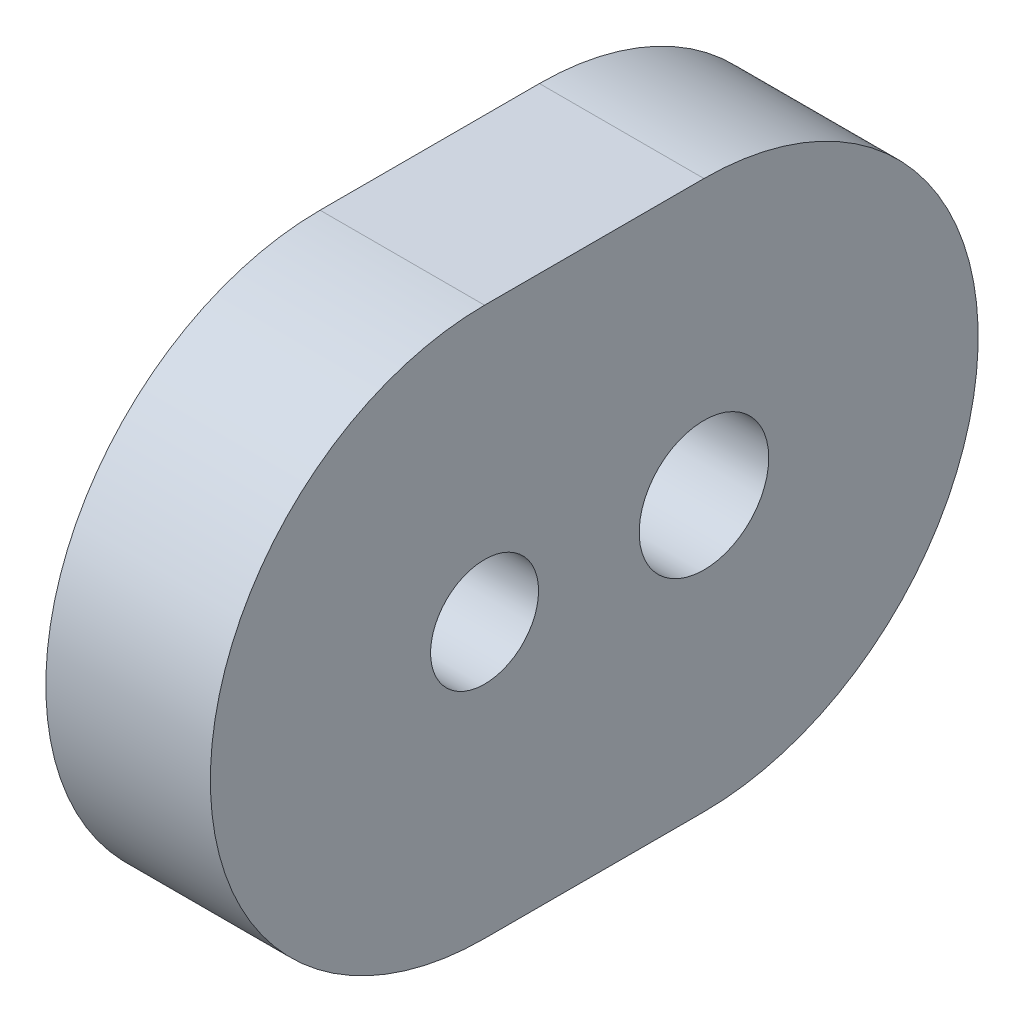
ISO-10303-21;
HEADER;
FILE_DESCRIPTION(('STEP AP214'),'2;1');
FILE_NAME('part.step','',(''),(''),'','','');
FILE_SCHEMA(('AUTOMOTIVE_DESIGN { 1 0 10303 214 1 1 1 1 }'));
ENDSEC;
DATA;
#1=APPLICATION_CONTEXT('core data for automotive mechanical design processes');
#2=APPLICATION_PROTOCOL_DEFINITION('international standard','automotive_design',2000,#1);
#3=PRODUCT_CONTEXT('',#1,'mechanical');
#4=PRODUCT('Part','Part','',(#3));
#5=PRODUCT_RELATED_PRODUCT_CATEGORY('part','',(#4));
#6=PRODUCT_DEFINITION_FORMATION('','',#4);
#7=PRODUCT_DEFINITION_CONTEXT('part definition',#1,'design');
#8=PRODUCT_DEFINITION('design','',#6,#7);
#9=PRODUCT_DEFINITION_SHAPE('','',#8);
#10=(LENGTH_UNIT() NAMED_UNIT(*) SI_UNIT(.MILLI.,.METRE.));
#11=(NAMED_UNIT(*) PLANE_ANGLE_UNIT() SI_UNIT($,.RADIAN.));
#12=(NAMED_UNIT(*) SI_UNIT($,.STERADIAN.) SOLID_ANGLE_UNIT());
#13=UNCERTAINTY_MEASURE_WITH_UNIT(LENGTH_MEASURE(1.E-05),#10,'distance_accuracy_value','');
#14=(GEOMETRIC_REPRESENTATION_CONTEXT(3) GLOBAL_UNCERTAINTY_ASSIGNED_CONTEXT((#13)) GLOBAL_UNIT_ASSIGNED_CONTEXT((#10,
#11,#12)) REPRESENTATION_CONTEXT('',''));
#15=CARTESIAN_POINT('',(0.,0.,0.));
#16=DIRECTION('',(0.,0.,1.));
#17=DIRECTION('',(1.,0.,0.));
#18=AXIS2_PLACEMENT_3D('',#15,#16,#17);
#19=CARTESIAN_POINT('',(3.81,6.35,0.));
#20=DIRECTION('',(-1.,0.,0.));
#21=DIRECTION('',(0.,0.,1.));
#22=AXIS2_PLACEMENT_3D('',#19,#20,#21);
#23=CYLINDRICAL_SURFACE('',#22,6.35);
#24=CARTESIAN_POINT('',(0.,6.35,0.));
#25=DIRECTION('',(1.,0.,0.));
#26=DIRECTION('',(0.,0.,-1.));
#27=AXIS2_PLACEMENT_3D('',#24,#25,#26);
#28=CIRCLE('',#27,6.35);
#29=CARTESIAN_POINT('',(0.,12.7,0.));
#30=VERTEX_POINT('',#29);
#31=CARTESIAN_POINT('',(0.,0.,0.));
#32=VERTEX_POINT('',#31);
#33=EDGE_CURVE('E95',#30,#32,#28,.T.);
#34=ORIENTED_EDGE('',*,*,#33,.T.);
#35=DIRECTION('',(-1.,0.,0.));
#36=VECTOR('',#35,1.);
#37=CARTESIAN_POINT('',(3.81,0.,0.));
#38=LINE('',#37,#36);
#39=CARTESIAN_POINT('',(3.81,0.,0.));
#40=VERTEX_POINT('',#39);
#41=EDGE_CURVE('E11',#40,#32,#38,.T.);
#42=ORIENTED_EDGE('',*,*,#41,.F.);
#43=CARTESIAN_POINT('',(3.81,6.35,0.));
#44=DIRECTION('',(1.,0.,0.));
#45=DIRECTION('',(0.,0.,-1.));
#46=AXIS2_PLACEMENT_3D('',#43,#44,#45);
#47=CIRCLE('',#46,6.35);
#48=CARTESIAN_POINT('',(3.81,12.7,0.));
#49=VERTEX_POINT('',#48);
#50=EDGE_CURVE('E83',#49,#40,#47,.T.);
#51=ORIENTED_EDGE('',*,*,#50,.F.);
#52=DIRECTION('',(-1.,0.,0.));
#53=VECTOR('',#52,1.);
#54=CARTESIAN_POINT('',(3.81,12.7,0.));
#55=LINE('',#54,#53);
#56=EDGE_CURVE('E91',#49,#30,#55,.T.);
#57=ORIENTED_EDGE('',*,*,#56,.T.);
#58=EDGE_LOOP('',(#34,#42,#51,#57));
#59=FACE_BOUND('',#58,.T.);
#60=ADVANCED_FACE('F32',(#59),#23,.T.);
#61=CARTESIAN_POINT('',(3.81,0.,0.));
#62=DIRECTION('',(0.,1.,0.));
#63=DIRECTION('',(0.,0.,1.));
#64=AXIS2_PLACEMENT_3D('',#61,#62,#63);
#65=PLANE('',#64);
#66=DIRECTION('',(0.,0.,-1.));
#67=VECTOR('',#66,1.);
#68=CARTESIAN_POINT('',(0.,0.,0.));
#69=LINE('',#68,#67);
#70=CARTESIAN_POINT('',(0.,0.,-5.08));
#71=VERTEX_POINT('',#70);
#72=EDGE_CURVE('E87',#32,#71,#69,.T.);
#73=ORIENTED_EDGE('',*,*,#72,.T.);
#74=DIRECTION('',(-1.,0.,0.));
#75=VECTOR('',#74,1.);
#76=CARTESIAN_POINT('',(3.81,0.,-5.08));
#77=LINE('',#76,#75);
#78=CARTESIAN_POINT('',(3.81,0.,-5.08));
#79=VERTEX_POINT('',#78);
#80=EDGE_CURVE('E40',#79,#71,#77,.T.);
#81=ORIENTED_EDGE('',*,*,#80,.F.);
#82=DIRECTION('',(0.,0.,-1.));
#83=VECTOR('',#82,1.);
#84=CARTESIAN_POINT('',(3.81,0.,0.));
#85=LINE('',#84,#83);
#86=EDGE_CURVE('E78',#40,#79,#85,.T.);
#87=ORIENTED_EDGE('',*,*,#86,.F.);
#88=ORIENTED_EDGE('',*,*,#41,.T.);
#89=EDGE_LOOP('',(#73,#81,#87,#88));
#90=FACE_BOUND('',#89,.T.);
#91=ADVANCED_FACE('F86',(#90),#65,.F.);
#92=CARTESIAN_POINT('',(3.81,6.35,-5.08));
#93=DIRECTION('',(-1.,0.,0.));
#94=DIRECTION('',(0.,0.,1.));
#95=AXIS2_PLACEMENT_3D('',#92,#93,#94);
#96=CYLINDRICAL_SURFACE('',#95,6.35);
#97=CARTESIAN_POINT('',(0.,6.35,-5.08));
#98=DIRECTION('',(1.,0.,0.));
#99=DIRECTION('',(0.,0.,1.));
#100=AXIS2_PLACEMENT_3D('',#97,#98,#99);
#101=CIRCLE('',#100,6.35);
#102=CARTESIAN_POINT('',(0.,12.7,-5.08));
#103=VERTEX_POINT('',#102);
#104=EDGE_CURVE('E65',#71,#103,#101,.T.);
#105=ORIENTED_EDGE('',*,*,#104,.T.);
#106=DIRECTION('',(-1.,0.,0.));
#107=VECTOR('',#106,1.);
#108=CARTESIAN_POINT('',(3.81,12.7,-5.08));
#109=LINE('',#108,#107);
#110=CARTESIAN_POINT('',(3.81,12.7,-5.08));
#111=VERTEX_POINT('',#110);
#112=EDGE_CURVE('E88',#111,#103,#109,.T.);
#113=ORIENTED_EDGE('',*,*,#112,.F.);
#114=CARTESIAN_POINT('',(3.81,6.35,-5.08));
#115=DIRECTION('',(1.,0.,0.));
#116=DIRECTION('',(0.,0.,1.));
#117=AXIS2_PLACEMENT_3D('',#114,#115,#116);
#118=CIRCLE('',#117,6.35);
#119=EDGE_CURVE('E81',#79,#111,#118,.T.);
#120=ORIENTED_EDGE('',*,*,#119,.F.);
#121=ORIENTED_EDGE('',*,*,#80,.T.);
#122=EDGE_LOOP('',(#105,#113,#120,#121));
#123=FACE_BOUND('',#122,.T.);
#124=ADVANCED_FACE('F89',(#123),#96,.T.);
#125=CARTESIAN_POINT('',(3.81,12.7,0.));
#126=DIRECTION('',(0.,-1.,0.));
#127=DIRECTION('',(0.,0.,-1.));
#128=AXIS2_PLACEMENT_3D('',#125,#126,#127);
#129=PLANE('',#128);
#130=DIRECTION('',(0.,0.,1.));
#131=VECTOR('',#130,1.);
#132=CARTESIAN_POINT('',(0.,12.7,0.));
#133=LINE('',#132,#131);
#134=EDGE_CURVE('E71',#103,#30,#133,.T.);
#135=ORIENTED_EDGE('',*,*,#134,.T.);
#136=ORIENTED_EDGE('',*,*,#56,.F.);
#137=DIRECTION('',(0.,0.,1.));
#138=VECTOR('',#137,1.);
#139=CARTESIAN_POINT('',(3.81,12.7,0.));
#140=LINE('',#139,#138);
#141=EDGE_CURVE('E48',#111,#49,#140,.T.);
#142=ORIENTED_EDGE('',*,*,#141,.F.);
#143=ORIENTED_EDGE('',*,*,#112,.T.);
#144=EDGE_LOOP('',(#135,#136,#142,#143));
#145=FACE_BOUND('',#144,.T.);
#146=ADVANCED_FACE('F103',(#145),#129,.F.);
#147=CARTESIAN_POINT('',(3.81,6.35,0.));
#148=DIRECTION('',(1.,0.,0.));
#149=DIRECTION('',(0.,0.,-1.));
#150=AXIS2_PLACEMENT_3D('',#147,#148,#149);
#151=PLANE('',#150);
#152=CARTESIAN_POINT('',(3.81,6.35,-5.08));
#153=DIRECTION('',(1.,0.,0.));
#154=DIRECTION('',(0.,0.,-1.));
#155=AXIS2_PLACEMENT_3D('',#152,#153,#154);
#156=CIRCLE('',#155,1.5);
#157=CARTESIAN_POINT('',(3.81,6.35,-6.58));
#158=VERTEX_POINT('',#157);
#159=EDGE_CURVE('E117',#158,#158,#156,.T.);
#160=ORIENTED_EDGE('',*,*,#159,.F.);
#161=EDGE_LOOP('',(#160));
#162=FACE_BOUND('',#161,.T.);
#163=CARTESIAN_POINT('',(3.81,6.35,0.));
#164=DIRECTION('',(1.,0.,0.));
#165=DIRECTION('',(0.,0.,-1.));
#166=AXIS2_PLACEMENT_3D('',#163,#164,#165);
#167=CIRCLE('',#166,1.25);
#168=CARTESIAN_POINT('',(3.81,6.35,-1.25));
#169=VERTEX_POINT('',#168);
#170=EDGE_CURVE('E111',#169,#169,#167,.T.);
#171=ORIENTED_EDGE('',*,*,#170,.F.);
#172=EDGE_LOOP('',(#171));
#173=FACE_BOUND('',#172,.T.);
#174=ORIENTED_EDGE('',*,*,#50,.T.);
#175=ORIENTED_EDGE('',*,*,#86,.T.);
#176=ORIENTED_EDGE('',*,*,#119,.T.);
#177=ORIENTED_EDGE('',*,*,#141,.T.);
#178=EDGE_LOOP('',(#174,#175,#176,#177));
#179=FACE_BOUND('',#178,.T.);
#180=ADVANCED_FACE('F79',(#162,#173,#179),#151,.T.);
#181=CARTESIAN_POINT('',(0.,6.35,0.));
#182=DIRECTION('',(1.,0.,0.));
#183=DIRECTION('',(0.,0.,-1.));
#184=AXIS2_PLACEMENT_3D('',#181,#182,#183);
#185=PLANE('',#184);
#186=CARTESIAN_POINT('',(0.,6.35,-5.08));
#187=DIRECTION('',(1.,0.,0.));
#188=DIRECTION('',(0.,0.,-1.));
#189=AXIS2_PLACEMENT_3D('',#186,#187,#188);
#190=CIRCLE('',#189,1.5);
#191=CARTESIAN_POINT('',(0.,6.35,-6.58));
#192=VERTEX_POINT('',#191);
#193=EDGE_CURVE('E114',#192,#192,#190,.T.);
#194=ORIENTED_EDGE('',*,*,#193,.T.);
#195=EDGE_LOOP('',(#194));
#196=FACE_BOUND('',#195,.T.);
#197=CARTESIAN_POINT('',(0.,6.35,0.));
#198=DIRECTION('',(1.,0.,0.));
#199=DIRECTION('',(0.,0.,-1.));
#200=AXIS2_PLACEMENT_3D('',#197,#198,#199);
#201=CIRCLE('',#200,1.25);
#202=CARTESIAN_POINT('',(0.,6.35,-1.25));
#203=VERTEX_POINT('',#202);
#204=EDGE_CURVE('E98',#203,#203,#201,.T.);
#205=ORIENTED_EDGE('',*,*,#204,.T.);
#206=EDGE_LOOP('',(#205));
#207=FACE_BOUND('',#206,.T.);
#208=ORIENTED_EDGE('',*,*,#33,.F.);
#209=ORIENTED_EDGE('',*,*,#134,.F.);
#210=ORIENTED_EDGE('',*,*,#104,.F.);
#211=ORIENTED_EDGE('',*,*,#72,.F.);
#212=EDGE_LOOP('',(#208,#209,#210,#211));
#213=FACE_BOUND('',#212,.T.);
#214=ADVANCED_FACE('F106',(#196,#207,#213),#185,.F.);
#215=CARTESIAN_POINT('',(3.81,6.35,0.));
#216=DIRECTION('',(1.,0.,0.));
#217=DIRECTION('',(0.,0.,-1.));
#218=AXIS2_PLACEMENT_3D('',#215,#216,#217);
#219=CYLINDRICAL_SURFACE('',#218,1.25);
#220=ORIENTED_EDGE('',*,*,#204,.F.);
#221=EDGE_LOOP('',(#220));
#222=FACE_BOUND('',#221,.T.);
#223=ORIENTED_EDGE('',*,*,#170,.T.);
#224=EDGE_LOOP('',(#223));
#225=FACE_BOUND('',#224,.T.);
#226=ADVANCED_FACE('F128',(#222,#225),#219,.F.);
#227=CARTESIAN_POINT('',(3.81,6.35,-5.08));
#228=DIRECTION('',(1.,0.,0.));
#229=DIRECTION('',(0.,0.,-1.));
#230=AXIS2_PLACEMENT_3D('',#227,#228,#229);
#231=CYLINDRICAL_SURFACE('',#230,1.5);
#232=ORIENTED_EDGE('',*,*,#193,.F.);
#233=EDGE_LOOP('',(#232));
#234=FACE_BOUND('',#233,.T.);
#235=ORIENTED_EDGE('',*,*,#159,.T.);
#236=EDGE_LOOP('',(#235));
#237=FACE_BOUND('',#236,.T.);
#238=ADVANCED_FACE('F121',(#234,#237),#231,.F.);
#239=CLOSED_SHELL('',(#60,#91,#124,#146,#180,#214,#226,#238));
#240=MANIFOLD_SOLID_BREP('B2',#239);
#241=ADVANCED_BREP_SHAPE_REPRESENTATION('',(#18,#240),#14);
#242=SHAPE_DEFINITION_REPRESENTATION(#9,#241);
ENDSEC;
END-ISO-10303-21;
